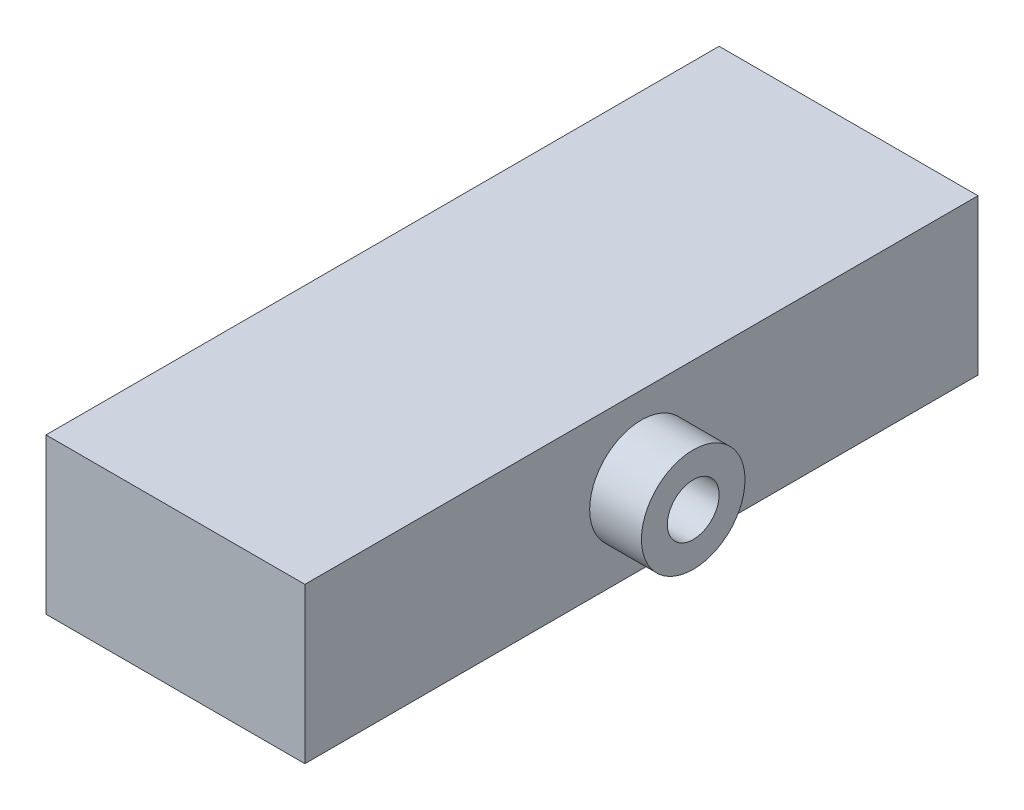
ISO-10303-21;
HEADER;
FILE_DESCRIPTION(('STEP AP214'),'2;1');
FILE_NAME('part.step','',(''),(''),'','','');
FILE_SCHEMA(('AUTOMOTIVE_DESIGN { 1 0 10303 214 1 1 1 1 }'));
ENDSEC;
DATA;
#1=APPLICATION_CONTEXT('core data for automotive mechanical design processes');
#2=APPLICATION_PROTOCOL_DEFINITION('international standard','automotive_design',2000,#1);
#3=PRODUCT_CONTEXT('',#1,'mechanical');
#4=PRODUCT('Part','Part','',(#3));
#5=PRODUCT_RELATED_PRODUCT_CATEGORY('part','',(#4));
#6=PRODUCT_DEFINITION_FORMATION('','',#4);
#7=PRODUCT_DEFINITION_CONTEXT('part definition',#1,'design');
#8=PRODUCT_DEFINITION('design','',#6,#7);
#9=PRODUCT_DEFINITION_SHAPE('','',#8);
#10=(LENGTH_UNIT() NAMED_UNIT(*) SI_UNIT(.MILLI.,.METRE.));
#11=(NAMED_UNIT(*) PLANE_ANGLE_UNIT() SI_UNIT($,.RADIAN.));
#12=(NAMED_UNIT(*) SI_UNIT($,.STERADIAN.) SOLID_ANGLE_UNIT());
#13=UNCERTAINTY_MEASURE_WITH_UNIT(LENGTH_MEASURE(1.E-05),#10,'distance_accuracy_value','');
#14=(GEOMETRIC_REPRESENTATION_CONTEXT(3) GLOBAL_UNCERTAINTY_ASSIGNED_CONTEXT((#13)) GLOBAL_UNIT_ASSIGNED_CONTEXT((#10,
#11,#12)) REPRESENTATION_CONTEXT('',''));
#15=CARTESIAN_POINT('',(0.,0.,0.));
#16=DIRECTION('',(0.,0.,1.));
#17=DIRECTION('',(1.,0.,0.));
#18=AXIS2_PLACEMENT_3D('',#15,#16,#17);
#19=CARTESIAN_POINT('',(2.5,1.5,0.));
#20=DIRECTION('',(-1.,0.,0.));
#21=DIRECTION('',(0.,0.,1.));
#22=AXIS2_PLACEMENT_3D('',#19,#20,#21);
#23=PLANE('',#22);
#24=DIRECTION('',(0.,0.,-1.));
#25=VECTOR('',#24,1.);
#26=CARTESIAN_POINT('',(2.5,0.,0.));
#27=LINE('',#26,#25);
#28=CARTESIAN_POINT('',(2.5,0.,0.));
#29=VERTEX_POINT('',#28);
#30=CARTESIAN_POINT('',(2.5,0.,-6.5));
#31=VERTEX_POINT('',#30);
#32=EDGE_CURVE('E68',#29,#31,#27,.T.);
#33=ORIENTED_EDGE('',*,*,#32,.T.);
#34=DIRECTION('',(0.,-1.,0.));
#35=VECTOR('',#34,1.);
#36=CARTESIAN_POINT('',(2.5,1.5,-6.5));
#37=LINE('',#36,#35);
#38=CARTESIAN_POINT('',(2.5,1.5,-6.5));
#39=VERTEX_POINT('',#38);
#40=EDGE_CURVE('E93',#39,#31,#37,.T.);
#41=ORIENTED_EDGE('',*,*,#40,.F.);
#42=DIRECTION('',(0.,0.,-1.));
#43=VECTOR('',#42,1.);
#44=CARTESIAN_POINT('',(2.5,1.5,0.));
#45=LINE('',#44,#43);
#46=CARTESIAN_POINT('',(2.5,1.5,0.));
#47=VERTEX_POINT('',#46);
#48=EDGE_CURVE('E85',#47,#39,#45,.T.);
#49=ORIENTED_EDGE('',*,*,#48,.F.);
#50=DIRECTION('',(0.,-1.,0.));
#51=VECTOR('',#50,1.);
#52=CARTESIAN_POINT('',(2.5,1.5,0.));
#53=LINE('',#52,#51);
#54=EDGE_CURVE('E90',#47,#29,#53,.T.);
#55=ORIENTED_EDGE('',*,*,#54,.T.);
#56=EDGE_LOOP('',(#33,#41,#49,#55));
#57=FACE_BOUND('',#56,.T.);
#58=CARTESIAN_POINT('',(2.5,0.75,-3.25));
#59=DIRECTION('',(-1.,0.,0.));
#60=DIRECTION('',(0.,0.,1.));
#61=AXIS2_PLACEMENT_3D('',#58,#59,#60);
#62=CIRCLE('',#61,0.5);
#63=CARTESIAN_POINT('',(2.5,0.75,-2.75));
#64=VERTEX_POINT('',#63);
#65=EDGE_CURVE('E11',#64,#64,#62,.F.);
#66=ORIENTED_EDGE('',*,*,#65,.F.);
#67=EDGE_LOOP('',(#66));
#68=FACE_BOUND('',#67,.T.);
#69=ADVANCED_FACE('F34',(#57,#68),#23,.F.);
#70=CARTESIAN_POINT('',(0.,1.5,0.));
#71=DIRECTION('',(1.,0.,0.));
#72=DIRECTION('',(0.,0.,-1.));
#73=AXIS2_PLACEMENT_3D('',#70,#71,#72);
#74=PLANE('',#73);
#75=CARTESIAN_POINT('',(0.,0.75,-0.75));
#76=DIRECTION('',(-1.,0.,0.));
#77=DIRECTION('',(0.,0.,1.));
#78=AXIS2_PLACEMENT_3D('',#75,#76,#77);
#79=CIRCLE('',#78,0.25);
#80=CARTESIAN_POINT('',(0.,0.75,-0.5));
#81=VERTEX_POINT('',#80);
#82=EDGE_CURVE('E187',#81,#81,#79,.T.);
#83=ORIENTED_EDGE('',*,*,#82,.F.);
#84=EDGE_LOOP('',(#83));
#85=FACE_BOUND('',#84,.T.);
#86=CARTESIAN_POINT('',(0.,0.749999999999999,-5.75));
#87=DIRECTION('',(-1.,0.,0.));
#88=DIRECTION('',(0.,0.,1.));
#89=AXIS2_PLACEMENT_3D('',#86,#87,#88);
#90=CIRCLE('',#89,0.25);
#91=CARTESIAN_POINT('',(0.,0.749999999999999,-5.5));
#92=VERTEX_POINT('',#91);
#93=EDGE_CURVE('E157',#92,#92,#90,.T.);
#94=ORIENTED_EDGE('',*,*,#93,.F.);
#95=EDGE_LOOP('',(#94));
#96=FACE_BOUND('',#95,.T.);
#97=DIRECTION('',(0.,0.,1.));
#98=VECTOR('',#97,1.);
#99=CARTESIAN_POINT('',(0.,0.,0.));
#100=LINE('',#99,#98);
#101=CARTESIAN_POINT('',(0.,0.,-6.5));
#102=VERTEX_POINT('',#101);
#103=CARTESIAN_POINT('',(0.,0.,0.));
#104=VERTEX_POINT('',#103);
#105=EDGE_CURVE('E101',#102,#104,#100,.T.);
#106=ORIENTED_EDGE('',*,*,#105,.T.);
#107=DIRECTION('',(0.,-1.,0.));
#108=VECTOR('',#107,1.);
#109=CARTESIAN_POINT('',(0.,1.5,0.));
#110=LINE('',#109,#108);
#111=CARTESIAN_POINT('',(0.,1.5,0.));
#112=VERTEX_POINT('',#111);
#113=EDGE_CURVE('E43',#112,#104,#110,.T.);
#114=ORIENTED_EDGE('',*,*,#113,.F.);
#115=DIRECTION('',(0.,0.,1.));
#116=VECTOR('',#115,1.);
#117=CARTESIAN_POINT('',(0.,1.5,0.));
#118=LINE('',#117,#116);
#119=CARTESIAN_POINT('',(0.,1.5,-6.5));
#120=VERTEX_POINT('',#119);
#121=EDGE_CURVE('E87',#120,#112,#118,.T.);
#122=ORIENTED_EDGE('',*,*,#121,.F.);
#123=DIRECTION('',(0.,-1.,0.));
#124=VECTOR('',#123,1.);
#125=CARTESIAN_POINT('',(0.,1.5,-6.5));
#126=LINE('',#125,#124);
#127=EDGE_CURVE('E97',#120,#102,#126,.T.);
#128=ORIENTED_EDGE('',*,*,#127,.T.);
#129=EDGE_LOOP('',(#106,#114,#122,#128));
#130=FACE_BOUND('',#129,.T.);
#131=ADVANCED_FACE('F36',(#85,#96,#130),#74,.F.);
#132=CARTESIAN_POINT('',(0.,1.5,0.));
#133=DIRECTION('',(0.,0.,-1.));
#134=DIRECTION('',(-1.,0.,0.));
#135=AXIS2_PLACEMENT_3D('',#132,#133,#134);
#136=PLANE('',#135);
#137=DIRECTION('',(1.,0.,0.));
#138=VECTOR('',#137,1.);
#139=CARTESIAN_POINT('',(0.,0.,0.));
#140=LINE('',#139,#138);
#141=EDGE_CURVE('E92',#104,#29,#140,.T.);
#142=ORIENTED_EDGE('',*,*,#141,.T.);
#143=ORIENTED_EDGE('',*,*,#54,.F.);
#144=DIRECTION('',(1.,0.,0.));
#145=VECTOR('',#144,1.);
#146=CARTESIAN_POINT('',(0.,1.5,0.));
#147=LINE('',#146,#145);
#148=EDGE_CURVE('E82',#112,#47,#147,.T.);
#149=ORIENTED_EDGE('',*,*,#148,.F.);
#150=ORIENTED_EDGE('',*,*,#113,.T.);
#151=EDGE_LOOP('',(#142,#143,#149,#150));
#152=FACE_BOUND('',#151,.T.);
#153=ADVANCED_FACE('F91',(#152),#136,.F.);
#154=CARTESIAN_POINT('',(0.,1.5,-6.5));
#155=DIRECTION('',(0.,0.,1.));
#156=DIRECTION('',(1.,0.,0.));
#157=AXIS2_PLACEMENT_3D('',#154,#155,#156);
#158=PLANE('',#157);
#159=DIRECTION('',(-1.,0.,0.));
#160=VECTOR('',#159,1.);
#161=CARTESIAN_POINT('',(0.,0.,-6.5));
#162=LINE('',#161,#160);
#163=EDGE_CURVE('E74',#31,#102,#162,.T.);
#164=ORIENTED_EDGE('',*,*,#163,.T.);
#165=ORIENTED_EDGE('',*,*,#127,.F.);
#166=DIRECTION('',(-1.,0.,0.));
#167=VECTOR('',#166,1.);
#168=CARTESIAN_POINT('',(0.,1.5,-6.5));
#169=LINE('',#168,#167);
#170=EDGE_CURVE('E51',#39,#120,#169,.T.);
#171=ORIENTED_EDGE('',*,*,#170,.F.);
#172=ORIENTED_EDGE('',*,*,#40,.T.);
#173=EDGE_LOOP('',(#164,#165,#171,#172));
#174=FACE_BOUND('',#173,.T.);
#175=ADVANCED_FACE('F123',(#174),#158,.F.);
#176=CARTESIAN_POINT('',(0.,1.5,0.));
#177=DIRECTION('',(0.,-1.,0.));
#178=DIRECTION('',(0.,0.,-1.));
#179=AXIS2_PLACEMENT_3D('',#176,#177,#178);
#180=PLANE('',#179);
#181=ORIENTED_EDGE('',*,*,#121,.T.);
#182=ORIENTED_EDGE('',*,*,#148,.T.);
#183=ORIENTED_EDGE('',*,*,#48,.T.);
#184=ORIENTED_EDGE('',*,*,#170,.T.);
#185=EDGE_LOOP('',(#181,#182,#183,#184));
#186=FACE_BOUND('',#185,.T.);
#187=ADVANCED_FACE('F83',(#186),#180,.F.);
#188=CARTESIAN_POINT('',(0.,0.,0.));
#189=DIRECTION('',(0.,-1.,0.));
#190=DIRECTION('',(0.,0.,-1.));
#191=AXIS2_PLACEMENT_3D('',#188,#189,#190);
#192=PLANE('',#191);
#193=ORIENTED_EDGE('',*,*,#105,.F.);
#194=ORIENTED_EDGE('',*,*,#163,.F.);
#195=ORIENTED_EDGE('',*,*,#32,.F.);
#196=ORIENTED_EDGE('',*,*,#141,.F.);
#197=EDGE_LOOP('',(#193,#194,#195,#196));
#198=FACE_BOUND('',#197,.T.);
#199=ADVANCED_FACE('F112',(#198),#192,.T.);
#200=CARTESIAN_POINT('',(3.,0.75,-3.25));
#201=DIRECTION('',(1.,0.,0.));
#202=DIRECTION('',(0.,0.,-1.));
#203=AXIS2_PLACEMENT_3D('',#200,#201,#202);
#204=PLANE('',#203);
#205=CARTESIAN_POINT('',(3.,0.75,-3.25));
#206=DIRECTION('',(1.,0.,0.));
#207=DIRECTION('',(0.,0.,-1.));
#208=AXIS2_PLACEMENT_3D('',#205,#206,#207);
#209=CIRCLE('',#208,0.5);
#210=CARTESIAN_POINT('',(3.,0.75,-3.75));
#211=VERTEX_POINT('',#210);
#212=EDGE_CURVE('E104',#211,#211,#209,.T.);
#213=ORIENTED_EDGE('',*,*,#212,.T.);
#214=EDGE_LOOP('',(#213));
#215=FACE_BOUND('',#214,.T.);
#216=CARTESIAN_POINT('',(3.,0.75,-3.25));
#217=DIRECTION('',(1.,0.,0.));
#218=DIRECTION('',(0.,0.,-1.));
#219=AXIS2_PLACEMENT_3D('',#216,#217,#218);
#220=CIRCLE('',#219,0.25);
#221=CARTESIAN_POINT('',(3.,0.75,-3.5));
#222=VERTEX_POINT('',#221);
#223=EDGE_CURVE('E151',#222,#222,#220,.T.);
#224=ORIENTED_EDGE('',*,*,#223,.F.);
#225=EDGE_LOOP('',(#224));
#226=FACE_BOUND('',#225,.T.);
#227=ADVANCED_FACE('F114',(#215,#226),#204,.T.);
#228=CARTESIAN_POINT('',(3.,0.75,-3.25));
#229=DIRECTION('',(-1.,0.,0.));
#230=DIRECTION('',(0.,0.,1.));
#231=AXIS2_PLACEMENT_3D('',#228,#229,#230);
#232=CYLINDRICAL_SURFACE('',#231,0.5);
#233=ORIENTED_EDGE('',*,*,#212,.F.);
#234=EDGE_LOOP('',(#233));
#235=FACE_BOUND('',#234,.T.);
#236=ORIENTED_EDGE('',*,*,#65,.T.);
#237=EDGE_LOOP('',(#236));
#238=FACE_BOUND('',#237,.T.);
#239=ADVANCED_FACE('F120',(#235,#238),#232,.T.);
#240=CARTESIAN_POINT('',(3.,0.75,-3.25));
#241=DIRECTION('',(-1.,0.,0.));
#242=DIRECTION('',(0.,0.,1.));
#243=AXIS2_PLACEMENT_3D('',#240,#241,#242);
#244=CYLINDRICAL_SURFACE('',#243,0.25);
#245=ORIENTED_EDGE('',*,*,#223,.T.);
#246=EDGE_LOOP('',(#245));
#247=FACE_BOUND('',#246,.T.);
#248=CARTESIAN_POINT('',(2.5,0.75,-3.25));
#249=DIRECTION('',(1.,0.,0.));
#250=DIRECTION('',(0.,0.,-1.));
#251=AXIS2_PLACEMENT_3D('',#248,#249,#250);
#252=CIRCLE('',#251,0.25);
#253=CARTESIAN_POINT('',(2.5,0.75,-3.5));
#254=VERTEX_POINT('',#253);
#255=EDGE_CURVE('E149',#254,#254,#252,.T.);
#256=ORIENTED_EDGE('',*,*,#255,.F.);
#257=EDGE_LOOP('',(#256));
#258=FACE_BOUND('',#257,.T.);
#259=ADVANCED_FACE('F136',(#247,#258),#244,.F.);
#260=ORIENTED_EDGE('',*,*,#255,.T.);
#261=EDGE_LOOP('',(#260));
#262=FACE_BOUND('',#261,.T.);
#263=ADVANCED_FACE('F128',(#262),#23,.F.);
#264=CARTESIAN_POINT('',(0.5,0.749999999999999,-5.75));
#265=DIRECTION('',(-1.,0.,0.));
#266=DIRECTION('',(0.,0.,1.));
#267=AXIS2_PLACEMENT_3D('',#264,#265,#266);
#268=CYLINDRICAL_SURFACE('',#267,0.25);
#269=CARTESIAN_POINT('',(0.5,0.749999999999999,-5.75));
#270=DIRECTION('',(-1.,0.,0.));
#271=DIRECTION('',(0.,0.,1.));
#272=AXIS2_PLACEMENT_3D('',#269,#270,#271);
#273=CIRCLE('',#272,0.25);
#274=CARTESIAN_POINT('',(0.5,0.749999999999999,-5.5));
#275=VERTEX_POINT('',#274);
#276=EDGE_CURVE('E152',#275,#275,#273,.T.);
#277=ORIENTED_EDGE('',*,*,#276,.F.);
#278=EDGE_LOOP('',(#277));
#279=FACE_BOUND('',#278,.T.);
#280=ORIENTED_EDGE('',*,*,#93,.T.);
#281=EDGE_LOOP('',(#280));
#282=FACE_BOUND('',#281,.T.);
#283=ADVANCED_FACE('F135',(#279,#282),#268,.F.);
#284=CARTESIAN_POINT('',(0.5,0.749999999999999,-5.75));
#285=DIRECTION('',(-1.,0.,0.));
#286=DIRECTION('',(0.,0.,1.));
#287=AXIS2_PLACEMENT_3D('',#284,#285,#286);
#288=PLANE('',#287);
#289=ORIENTED_EDGE('',*,*,#276,.T.);
#290=EDGE_LOOP('',(#289));
#291=FACE_BOUND('',#290,.T.);
#292=ADVANCED_FACE('F142',(#291),#288,.T.);
#293=CARTESIAN_POINT('',(0.5,0.75,-0.75));
#294=DIRECTION('',(-1.,0.,0.));
#295=DIRECTION('',(0.,0.,1.));
#296=AXIS2_PLACEMENT_3D('',#293,#294,#295);
#297=CYLINDRICAL_SURFACE('',#296,0.25);
#298=CARTESIAN_POINT('',(0.5,0.75,-0.75));
#299=DIRECTION('',(-1.,0.,0.));
#300=DIRECTION('',(0.,0.,1.));
#301=AXIS2_PLACEMENT_3D('',#298,#299,#300);
#302=CIRCLE('',#301,0.25);
#303=CARTESIAN_POINT('',(0.5,0.75,-0.5));
#304=VERTEX_POINT('',#303);
#305=EDGE_CURVE('E186',#304,#304,#302,.T.);
#306=ORIENTED_EDGE('',*,*,#305,.F.);
#307=EDGE_LOOP('',(#306));
#308=FACE_BOUND('',#307,.T.);
#309=ORIENTED_EDGE('',*,*,#82,.T.);
#310=EDGE_LOOP('',(#309));
#311=FACE_BOUND('',#310,.T.);
#312=ADVANCED_FACE('F174',(#308,#311),#297,.F.);
#313=CARTESIAN_POINT('',(0.5,0.75,-0.75));
#314=DIRECTION('',(-1.,0.,0.));
#315=DIRECTION('',(0.,0.,1.));
#316=AXIS2_PLACEMENT_3D('',#313,#314,#315);
#317=PLANE('',#316);
#318=ORIENTED_EDGE('',*,*,#305,.T.);
#319=EDGE_LOOP('',(#318));
#320=FACE_BOUND('',#319,.T.);
#321=ADVANCED_FACE('F178',(#320),#317,.T.);
#322=CLOSED_SHELL('',(#69,#131,#153,#175,#187,#199,#227,#239,#259,#263,#283,#292,#312,#321));
#323=MANIFOLD_SOLID_BREP('B2',#322);
#324=ADVANCED_BREP_SHAPE_REPRESENTATION('',(#18,#323),#14);
#325=SHAPE_DEFINITION_REPRESENTATION(#9,#324);
ENDSEC;
END-ISO-10303-21;
